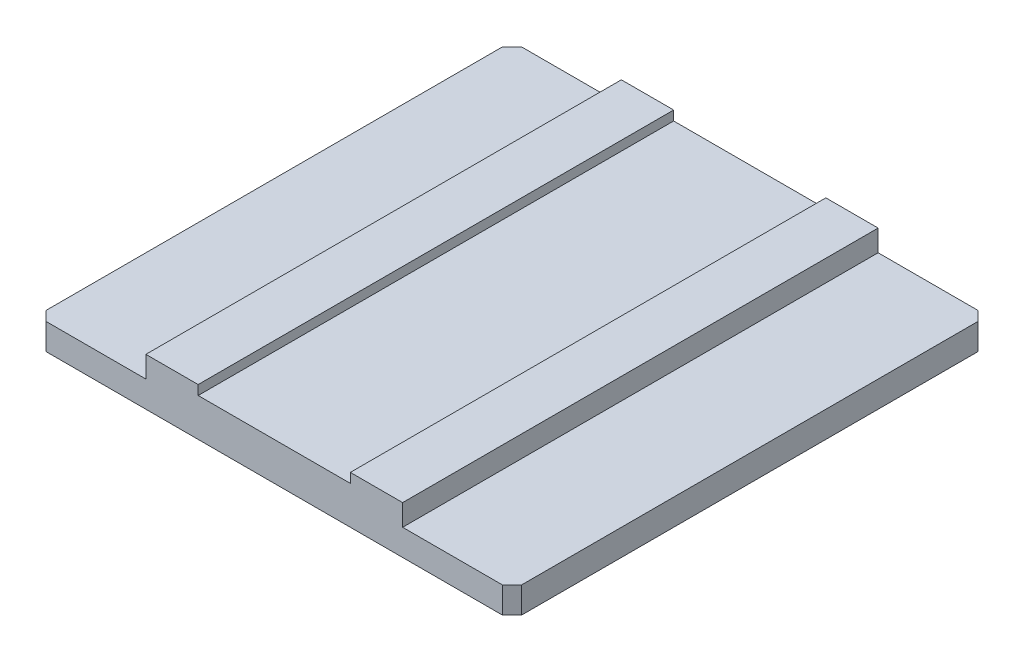
ISO-10303-21;
HEADER;
FILE_DESCRIPTION(('STEP AP214'),'2;1');
FILE_NAME('part.step','',(''),(''),'','','');
FILE_SCHEMA(('AUTOMOTIVE_DESIGN { 1 0 10303 214 1 1 1 1 }'));
ENDSEC;
DATA;
#1=APPLICATION_CONTEXT('core data for automotive mechanical design processes');
#2=APPLICATION_PROTOCOL_DEFINITION('international standard','automotive_design',2000,#1);
#3=PRODUCT_CONTEXT('',#1,'mechanical');
#4=PRODUCT('Part','Part','',(#3));
#5=PRODUCT_RELATED_PRODUCT_CATEGORY('part','',(#4));
#6=PRODUCT_DEFINITION_FORMATION('','',#4);
#7=PRODUCT_DEFINITION_CONTEXT('part definition',#1,'design');
#8=PRODUCT_DEFINITION('design','',#6,#7);
#9=PRODUCT_DEFINITION_SHAPE('','',#8);
#10=(LENGTH_UNIT() NAMED_UNIT(*) SI_UNIT(.MILLI.,.METRE.));
#11=(NAMED_UNIT(*) PLANE_ANGLE_UNIT() SI_UNIT($,.RADIAN.));
#12=(NAMED_UNIT(*) SI_UNIT($,.STERADIAN.) SOLID_ANGLE_UNIT());
#13=UNCERTAINTY_MEASURE_WITH_UNIT(LENGTH_MEASURE(1.E-05),#10,'distance_accuracy_value','');
#14=(GEOMETRIC_REPRESENTATION_CONTEXT(3) GLOBAL_UNCERTAINTY_ASSIGNED_CONTEXT((#13)) GLOBAL_UNIT_ASSIGNED_CONTEXT((#10,
#11,#12)) REPRESENTATION_CONTEXT('',''));
#15=CARTESIAN_POINT('',(0.,0.,0.));
#16=DIRECTION('',(0.,0.,1.));
#17=DIRECTION('',(1.,0.,0.));
#18=AXIS2_PLACEMENT_3D('',#15,#16,#17);
#19=CARTESIAN_POINT('',(50.,0.,100.));
#20=DIRECTION('',(-1.,0.,0.));
#21=DIRECTION('',(0.,0.,1.));
#22=AXIS2_PLACEMENT_3D('',#19,#20,#21);
#23=PLANE('',#22);
#24=DIRECTION('',(0.,0.,-1.));
#25=VECTOR('',#24,1.);
#26=CARTESIAN_POINT('',(50.,0.,100.));
#27=LINE('',#26,#25);
#28=CARTESIAN_POINT('',(50.,0.,98.));
#29=VERTEX_POINT('',#28);
#30=CARTESIAN_POINT('',(50.,0.,2.00000000000002));
#31=VERTEX_POINT('',#30);
#32=EDGE_CURVE('E216',#29,#31,#27,.T.);
#33=ORIENTED_EDGE('',*,*,#32,.T.);
#34=DIRECTION('',(0.,1.,0.));
#35=VECTOR('',#34,1.);
#36=CARTESIAN_POINT('',(50.,0.,2.00000000000002));
#37=LINE('',#36,#35);
#38=CARTESIAN_POINT('',(50.,5.5,2.00000000000002));
#39=VERTEX_POINT('',#38);
#40=EDGE_CURVE('E320',#31,#39,#37,.T.);
#41=ORIENTED_EDGE('',*,*,#40,.T.);
#42=DIRECTION('',(0.,0.,-1.));
#43=VECTOR('',#42,1.);
#44=CARTESIAN_POINT('',(50.,5.5,100.));
#45=LINE('',#44,#43);
#46=CARTESIAN_POINT('',(50.,5.5,98.));
#47=VERTEX_POINT('',#46);
#48=EDGE_CURVE('E182',#47,#39,#45,.T.);
#49=ORIENTED_EDGE('',*,*,#48,.F.);
#50=DIRECTION('',(0.,-1.,0.));
#51=VECTOR('',#50,1.);
#52=CARTESIAN_POINT('',(50.,0.,98.));
#53=LINE('',#52,#51);
#54=EDGE_CURVE('E317',#47,#29,#53,.T.);
#55=ORIENTED_EDGE('',*,*,#54,.T.);
#56=EDGE_LOOP('',(#33,#41,#49,#55));
#57=FACE_BOUND('',#56,.T.);
#58=ADVANCED_FACE('F47',(#57),#23,.F.);
#59=CARTESIAN_POINT('',(50.,5.5,100.));
#60=DIRECTION('',(0.,-1.,0.));
#61=DIRECTION('',(1.,0.,0.));
#62=AXIS2_PLACEMENT_3D('',#59,#60,#61);
#63=PLANE('',#62);
#64=ORIENTED_EDGE('',*,*,#48,.T.);
#65=DIRECTION('',(0.707106781186548,0.,0.707106781186548));
#66=VECTOR('',#65,1.);
#67=CARTESIAN_POINT('',(50.,5.5,2.00000000000002));
#68=LINE('',#67,#66);
#69=CARTESIAN_POINT('',(48.,5.5,0.));
#70=VERTEX_POINT('',#69);
#71=EDGE_CURVE('E71',#39,#70,#68,.F.);
#72=ORIENTED_EDGE('',*,*,#71,.T.);
#73=DIRECTION('',(-1.,0.,0.));
#74=VECTOR('',#73,1.);
#75=CARTESIAN_POINT('',(50.,5.5,0.));
#76=LINE('',#75,#74);
#77=CARTESIAN_POINT('',(27.,5.5,0.));
#78=VERTEX_POINT('',#77);
#79=EDGE_CURVE('E178',#70,#78,#76,.T.);
#80=ORIENTED_EDGE('',*,*,#79,.T.);
#81=DIRECTION('',(0.,0.,-1.));
#82=VECTOR('',#81,1.);
#83=CARTESIAN_POINT('',(27.,5.5,100.));
#84=LINE('',#83,#82);
#85=CARTESIAN_POINT('',(27.,5.5,100.));
#86=VERTEX_POINT('',#85);
#87=EDGE_CURVE('E174',#86,#78,#84,.T.);
#88=ORIENTED_EDGE('',*,*,#87,.F.);
#89=DIRECTION('',(-1.,0.,0.));
#90=VECTOR('',#89,1.);
#91=CARTESIAN_POINT('',(50.,5.5,100.));
#92=LINE('',#91,#90);
#93=CARTESIAN_POINT('',(48.,5.5,100.));
#94=VERTEX_POINT('',#93);
#95=EDGE_CURVE('E162',#94,#86,#92,.T.);
#96=ORIENTED_EDGE('',*,*,#95,.F.);
#97=DIRECTION('',(0.707106781186548,0.,-0.707106781186548));
#98=VECTOR('',#97,1.);
#99=CARTESIAN_POINT('',(48.,5.5,100.));
#100=LINE('',#99,#98);
#101=EDGE_CURVE('E64',#94,#47,#100,.T.);
#102=ORIENTED_EDGE('',*,*,#101,.T.);
#103=EDGE_LOOP('',(#64,#72,#80,#88,#96,#102));
#104=FACE_BOUND('',#103,.T.);
#105=ADVANCED_FACE('F176',(#104),#63,.F.);
#106=CARTESIAN_POINT('',(27.,5.5,100.));
#107=DIRECTION('',(-1.,0.,0.));
#108=DIRECTION('',(0.,0.,1.));
#109=AXIS2_PLACEMENT_3D('',#106,#107,#108);
#110=PLANE('',#109);
#111=DIRECTION('',(0.,1.,0.));
#112=VECTOR('',#111,1.);
#113=CARTESIAN_POINT('',(27.,5.5,0.));
#114=LINE('',#113,#112);
#115=CARTESIAN_POINT('',(27.,10.,0.));
#116=VERTEX_POINT('',#115);
#117=EDGE_CURVE('E219',#78,#116,#114,.T.);
#118=ORIENTED_EDGE('',*,*,#117,.T.);
#119=DIRECTION('',(0.,0.,-1.));
#120=VECTOR('',#119,1.);
#121=CARTESIAN_POINT('',(27.,10.,100.));
#122=LINE('',#121,#120);
#123=CARTESIAN_POINT('',(27.,10.,100.));
#124=VERTEX_POINT('',#123);
#125=EDGE_CURVE('E183',#124,#116,#122,.T.);
#126=ORIENTED_EDGE('',*,*,#125,.F.);
#127=DIRECTION('',(0.,1.,0.));
#128=VECTOR('',#127,1.);
#129=CARTESIAN_POINT('',(27.,5.5,100.));
#130=LINE('',#129,#128);
#131=EDGE_CURVE('E167',#86,#124,#130,.T.);
#132=ORIENTED_EDGE('',*,*,#131,.F.);
#133=ORIENTED_EDGE('',*,*,#87,.T.);
#134=EDGE_LOOP('',(#118,#126,#132,#133));
#135=FACE_BOUND('',#134,.T.);
#136=ADVANCED_FACE('F185',(#135),#110,.F.);
#137=CARTESIAN_POINT('',(27.,10.,100.));
#138=DIRECTION('',(0.,-1.,0.));
#139=DIRECTION('',(1.,0.,0.));
#140=AXIS2_PLACEMENT_3D('',#137,#138,#139);
#141=PLANE('',#140);
#142=DIRECTION('',(-1.,0.,0.));
#143=VECTOR('',#142,1.);
#144=CARTESIAN_POINT('',(27.,10.,0.));
#145=LINE('',#144,#143);
#146=CARTESIAN_POINT('',(16.,10.,0.));
#147=VERTEX_POINT('',#146);
#148=EDGE_CURVE('E222',#116,#147,#145,.T.);
#149=ORIENTED_EDGE('',*,*,#148,.T.);
#150=DIRECTION('',(0.,0.,-1.));
#151=VECTOR('',#150,1.);
#152=CARTESIAN_POINT('',(16.,10.,100.));
#153=LINE('',#152,#151);
#154=CARTESIAN_POINT('',(16.,10.,100.));
#155=VERTEX_POINT('',#154);
#156=EDGE_CURVE('E278',#155,#147,#153,.T.);
#157=ORIENTED_EDGE('',*,*,#156,.F.);
#158=DIRECTION('',(-1.,0.,0.));
#159=VECTOR('',#158,1.);
#160=CARTESIAN_POINT('',(27.,10.,100.));
#161=LINE('',#160,#159);
#162=EDGE_CURVE('E189',#124,#155,#161,.T.);
#163=ORIENTED_EDGE('',*,*,#162,.F.);
#164=ORIENTED_EDGE('',*,*,#125,.T.);
#165=EDGE_LOOP('',(#149,#157,#163,#164));
#166=FACE_BOUND('',#165,.T.);
#167=ADVANCED_FACE('F386',(#166),#141,.F.);
#168=CARTESIAN_POINT('',(16.,10.,100.));
#169=DIRECTION('',(1.,0.,0.));
#170=DIRECTION('',(0.,0.,-1.));
#171=AXIS2_PLACEMENT_3D('',#168,#169,#170);
#172=PLANE('',#171);
#173=DIRECTION('',(0.,-1.,0.));
#174=VECTOR('',#173,1.);
#175=CARTESIAN_POINT('',(16.,10.,0.));
#176=LINE('',#175,#174);
#177=CARTESIAN_POINT('',(16.,8.,0.));
#178=VERTEX_POINT('',#177);
#179=EDGE_CURVE('E225',#147,#178,#176,.T.);
#180=ORIENTED_EDGE('',*,*,#179,.T.);
#181=DIRECTION('',(0.,0.,-1.));
#182=VECTOR('',#181,1.);
#183=CARTESIAN_POINT('',(16.,8.,100.));
#184=LINE('',#183,#182);
#185=CARTESIAN_POINT('',(16.,8.,100.));
#186=VERTEX_POINT('',#185);
#187=EDGE_CURVE('E274',#186,#178,#184,.T.);
#188=ORIENTED_EDGE('',*,*,#187,.F.);
#189=DIRECTION('',(0.,-1.,0.));
#190=VECTOR('',#189,1.);
#191=CARTESIAN_POINT('',(16.,10.,100.));
#192=LINE('',#191,#190);
#193=EDGE_CURVE('E192',#155,#186,#192,.T.);
#194=ORIENTED_EDGE('',*,*,#193,.F.);
#195=ORIENTED_EDGE('',*,*,#156,.T.);
#196=EDGE_LOOP('',(#180,#188,#194,#195));
#197=FACE_BOUND('',#196,.T.);
#198=ADVANCED_FACE('F383',(#197),#172,.F.);
#199=CARTESIAN_POINT('',(16.,8.,100.));
#200=DIRECTION('',(0.,-1.,0.));
#201=DIRECTION('',(1.,0.,0.));
#202=AXIS2_PLACEMENT_3D('',#199,#200,#201);
#203=PLANE('',#202);
#204=DIRECTION('',(-1.,0.,0.));
#205=VECTOR('',#204,1.);
#206=CARTESIAN_POINT('',(16.,8.,0.));
#207=LINE('',#206,#205);
#208=CARTESIAN_POINT('',(-16.,8.,0.));
#209=VERTEX_POINT('',#208);
#210=EDGE_CURVE('E228',#178,#209,#207,.T.);
#211=ORIENTED_EDGE('',*,*,#210,.T.);
#212=DIRECTION('',(0.,0.,-1.));
#213=VECTOR('',#212,1.);
#214=CARTESIAN_POINT('',(-16.,8.,100.));
#215=LINE('',#214,#213);
#216=CARTESIAN_POINT('',(-16.,8.,100.));
#217=VERTEX_POINT('',#216);
#218=EDGE_CURVE('E270',#217,#209,#215,.T.);
#219=ORIENTED_EDGE('',*,*,#218,.F.);
#220=DIRECTION('',(-1.,0.,0.));
#221=VECTOR('',#220,1.);
#222=CARTESIAN_POINT('',(16.,8.,100.));
#223=LINE('',#222,#221);
#224=EDGE_CURVE('E197',#186,#217,#223,.T.);
#225=ORIENTED_EDGE('',*,*,#224,.F.);
#226=ORIENTED_EDGE('',*,*,#187,.T.);
#227=EDGE_LOOP('',(#211,#219,#225,#226));
#228=FACE_BOUND('',#227,.T.);
#229=ADVANCED_FACE('F378',(#228),#203,.F.);
#230=CARTESIAN_POINT('',(-16.,10.,100.));
#231=DIRECTION('',(-1.,0.,0.));
#232=DIRECTION('',(0.,0.,1.));
#233=AXIS2_PLACEMENT_3D('',#230,#231,#232);
#234=PLANE('',#233);
#235=DIRECTION('',(0.,1.,0.));
#236=VECTOR('',#235,1.);
#237=CARTESIAN_POINT('',(-16.,10.,0.));
#238=LINE('',#237,#236);
#239=CARTESIAN_POINT('',(-16.,10.,0.));
#240=VERTEX_POINT('',#239);
#241=EDGE_CURVE('E231',#209,#240,#238,.T.);
#242=ORIENTED_EDGE('',*,*,#241,.T.);
#243=DIRECTION('',(0.,0.,-1.));
#244=VECTOR('',#243,1.);
#245=CARTESIAN_POINT('',(-16.,10.,100.));
#246=LINE('',#245,#244);
#247=CARTESIAN_POINT('',(-16.,10.,100.));
#248=VERTEX_POINT('',#247);
#249=EDGE_CURVE('E266',#248,#240,#246,.T.);
#250=ORIENTED_EDGE('',*,*,#249,.F.);
#251=DIRECTION('',(0.,1.,0.));
#252=VECTOR('',#251,1.);
#253=CARTESIAN_POINT('',(-16.,10.,100.));
#254=LINE('',#253,#252);
#255=EDGE_CURVE('E200',#217,#248,#254,.T.);
#256=ORIENTED_EDGE('',*,*,#255,.F.);
#257=ORIENTED_EDGE('',*,*,#218,.T.);
#258=EDGE_LOOP('',(#242,#250,#256,#257));
#259=FACE_BOUND('',#258,.T.);
#260=ADVANCED_FACE('F373',(#259),#234,.F.);
#261=CARTESIAN_POINT('',(-27.,10.,100.));
#262=DIRECTION('',(0.,-1.,0.));
#263=DIRECTION('',(1.,0.,0.));
#264=AXIS2_PLACEMENT_3D('',#261,#262,#263);
#265=PLANE('',#264);
#266=DIRECTION('',(-1.,0.,0.));
#267=VECTOR('',#266,1.);
#268=CARTESIAN_POINT('',(-27.,10.,0.));
#269=LINE('',#268,#267);
#270=CARTESIAN_POINT('',(-27.,10.,0.));
#271=VERTEX_POINT('',#270);
#272=EDGE_CURVE('E234',#240,#271,#269,.T.);
#273=ORIENTED_EDGE('',*,*,#272,.T.);
#274=DIRECTION('',(0.,0.,-1.));
#275=VECTOR('',#274,1.);
#276=CARTESIAN_POINT('',(-27.,10.,100.));
#277=LINE('',#276,#275);
#278=CARTESIAN_POINT('',(-27.,10.,100.));
#279=VERTEX_POINT('',#278);
#280=EDGE_CURVE('E262',#279,#271,#277,.T.);
#281=ORIENTED_EDGE('',*,*,#280,.F.);
#282=DIRECTION('',(-1.,0.,0.));
#283=VECTOR('',#282,1.);
#284=CARTESIAN_POINT('',(-27.,10.,100.));
#285=LINE('',#284,#283);
#286=EDGE_CURVE('E203',#248,#279,#285,.T.);
#287=ORIENTED_EDGE('',*,*,#286,.F.);
#288=ORIENTED_EDGE('',*,*,#249,.T.);
#289=EDGE_LOOP('',(#273,#281,#287,#288));
#290=FACE_BOUND('',#289,.T.);
#291=ADVANCED_FACE('F369',(#290),#265,.F.);
#292=CARTESIAN_POINT('',(-27.,5.5,100.));
#293=DIRECTION('',(1.,0.,0.));
#294=DIRECTION('',(0.,0.,-1.));
#295=AXIS2_PLACEMENT_3D('',#292,#293,#294);
#296=PLANE('',#295);
#297=DIRECTION('',(0.,-1.,0.));
#298=VECTOR('',#297,1.);
#299=CARTESIAN_POINT('',(-27.,5.5,0.));
#300=LINE('',#299,#298);
#301=CARTESIAN_POINT('',(-27.,5.5,0.));
#302=VERTEX_POINT('',#301);
#303=EDGE_CURVE('E237',#271,#302,#300,.T.);
#304=ORIENTED_EDGE('',*,*,#303,.T.);
#305=DIRECTION('',(0.,0.,-1.));
#306=VECTOR('',#305,1.);
#307=CARTESIAN_POINT('',(-27.,5.5,100.));
#308=LINE('',#307,#306);
#309=CARTESIAN_POINT('',(-27.,5.5,100.));
#310=VERTEX_POINT('',#309);
#311=EDGE_CURVE('E258',#310,#302,#308,.T.);
#312=ORIENTED_EDGE('',*,*,#311,.F.);
#313=DIRECTION('',(0.,-1.,0.));
#314=VECTOR('',#313,1.);
#315=CARTESIAN_POINT('',(-27.,5.5,100.));
#316=LINE('',#315,#314);
#317=EDGE_CURVE('E206',#279,#310,#316,.T.);
#318=ORIENTED_EDGE('',*,*,#317,.F.);
#319=ORIENTED_EDGE('',*,*,#280,.T.);
#320=EDGE_LOOP('',(#304,#312,#318,#319));
#321=FACE_BOUND('',#320,.T.);
#322=ADVANCED_FACE('F365',(#321),#296,.F.);
#323=CARTESIAN_POINT('',(-50.,5.5,100.));
#324=DIRECTION('',(0.,-1.,0.));
#325=DIRECTION('',(1.,0.,0.));
#326=AXIS2_PLACEMENT_3D('',#323,#324,#325);
#327=PLANE('',#326);
#328=DIRECTION('',(-1.,0.,0.));
#329=VECTOR('',#328,1.);
#330=CARTESIAN_POINT('',(-50.,5.5,0.));
#331=LINE('',#330,#329);
#332=CARTESIAN_POINT('',(-48.,5.5,0.));
#333=VERTEX_POINT('',#332);
#334=EDGE_CURVE('E240',#302,#333,#331,.T.);
#335=ORIENTED_EDGE('',*,*,#334,.T.);
#336=DIRECTION('',(0.707106781186548,0.,-0.707106781186548));
#337=VECTOR('',#336,1.);
#338=CARTESIAN_POINT('',(-50.,5.5,2.00000000000002));
#339=LINE('',#338,#337);
#340=CARTESIAN_POINT('',(-50.,5.5,2.00000000000002));
#341=VERTEX_POINT('',#340);
#342=EDGE_CURVE('E314',#333,#341,#339,.F.);
#343=ORIENTED_EDGE('',*,*,#342,.T.);
#344=DIRECTION('',(0.,0.,-1.));
#345=VECTOR('',#344,1.);
#346=CARTESIAN_POINT('',(-50.,5.5,100.));
#347=LINE('',#346,#345);
#348=CARTESIAN_POINT('',(-50.,5.5,98.));
#349=VERTEX_POINT('',#348);
#350=EDGE_CURVE('E254',#349,#341,#347,.T.);
#351=ORIENTED_EDGE('',*,*,#350,.F.);
#352=DIRECTION('',(0.707106781186548,0.,0.707106781186548));
#353=VECTOR('',#352,1.);
#354=CARTESIAN_POINT('',(-48.,5.5,100.));
#355=LINE('',#354,#353);
#356=CARTESIAN_POINT('',(-48.,5.5,100.));
#357=VERTEX_POINT('',#356);
#358=EDGE_CURVE('E311',#349,#357,#355,.T.);
#359=ORIENTED_EDGE('',*,*,#358,.T.);
#360=DIRECTION('',(-1.,0.,0.));
#361=VECTOR('',#360,1.);
#362=CARTESIAN_POINT('',(-50.,5.5,100.));
#363=LINE('',#362,#361);
#364=EDGE_CURVE('E209',#310,#357,#363,.T.);
#365=ORIENTED_EDGE('',*,*,#364,.F.);
#366=ORIENTED_EDGE('',*,*,#311,.T.);
#367=EDGE_LOOP('',(#335,#343,#351,#359,#365,#366));
#368=FACE_BOUND('',#367,.T.);
#369=ADVANCED_FACE('F355',(#368),#327,.F.);
#370=CARTESIAN_POINT('',(-50.,0.,100.));
#371=DIRECTION('',(1.,0.,0.));
#372=DIRECTION('',(0.,0.,-1.));
#373=AXIS2_PLACEMENT_3D('',#370,#371,#372);
#374=PLANE('',#373);
#375=ORIENTED_EDGE('',*,*,#350,.T.);
#376=DIRECTION('',(0.,-1.,0.));
#377=VECTOR('',#376,1.);
#378=CARTESIAN_POINT('',(-50.,0.,2.00000000000002));
#379=LINE('',#378,#377);
#380=CARTESIAN_POINT('',(-50.,0.,2.00000000000002));
#381=VERTEX_POINT('',#380);
#382=EDGE_CURVE('E289',#341,#381,#379,.T.);
#383=ORIENTED_EDGE('',*,*,#382,.T.);
#384=DIRECTION('',(0.,0.,-1.));
#385=VECTOR('',#384,1.);
#386=CARTESIAN_POINT('',(-50.,0.,100.));
#387=LINE('',#386,#385);
#388=CARTESIAN_POINT('',(-50.,0.,98.));
#389=VERTEX_POINT('',#388);
#390=EDGE_CURVE('E250',#389,#381,#387,.T.);
#391=ORIENTED_EDGE('',*,*,#390,.F.);
#392=DIRECTION('',(0.,1.,0.));
#393=VECTOR('',#392,1.);
#394=CARTESIAN_POINT('',(-50.,5.5,98.));
#395=LINE('',#394,#393);
#396=EDGE_CURVE('E286',#389,#349,#395,.T.);
#397=ORIENTED_EDGE('',*,*,#396,.T.);
#398=EDGE_LOOP('',(#375,#383,#391,#397));
#399=FACE_BOUND('',#398,.T.);
#400=ADVANCED_FACE('F357',(#399),#374,.F.);
#401=CARTESIAN_POINT('',(-50.,0.,100.));
#402=DIRECTION('',(0.,1.,0.));
#403=DIRECTION('',(0.,0.,1.));
#404=AXIS2_PLACEMENT_3D('',#401,#402,#403);
#405=PLANE('',#404);
#406=ORIENTED_EDGE('',*,*,#390,.T.);
#407=DIRECTION('',(-0.707106781186548,0.,0.707106781186548));
#408=VECTOR('',#407,1.);
#409=CARTESIAN_POINT('',(-50.,0.,2.00000000000002));
#410=LINE('',#409,#408);
#411=CARTESIAN_POINT('',(-48.,0.,0.));
#412=VERTEX_POINT('',#411);
#413=EDGE_CURVE('E302',#381,#412,#410,.F.);
#414=ORIENTED_EDGE('',*,*,#413,.T.);
#415=DIRECTION('',(1.,0.,0.));
#416=VECTOR('',#415,1.);
#417=CARTESIAN_POINT('',(-50.,0.,0.));
#418=LINE('',#417,#416);
#419=CARTESIAN_POINT('',(48.,0.,0.));
#420=VERTEX_POINT('',#419);
#421=EDGE_CURVE('E171',#412,#420,#418,.T.);
#422=ORIENTED_EDGE('',*,*,#421,.T.);
#423=DIRECTION('',(-0.707106781186548,0.,-0.707106781186548));
#424=VECTOR('',#423,1.);
#425=CARTESIAN_POINT('',(50.,0.,2.00000000000002));
#426=LINE('',#425,#424);
#427=EDGE_CURVE('E299',#420,#31,#426,.F.);
#428=ORIENTED_EDGE('',*,*,#427,.T.);
#429=ORIENTED_EDGE('',*,*,#32,.F.);
#430=DIRECTION('',(-0.707106781186548,0.,0.707106781186548));
#431=VECTOR('',#430,1.);
#432=CARTESIAN_POINT('',(48.,0.,100.));
#433=LINE('',#432,#431);
#434=CARTESIAN_POINT('',(48.,0.,100.));
#435=VERTEX_POINT('',#434);
#436=EDGE_CURVE('E296',#29,#435,#433,.T.);
#437=ORIENTED_EDGE('',*,*,#436,.T.);
#438=DIRECTION('',(1.,0.,0.));
#439=VECTOR('',#438,1.);
#440=CARTESIAN_POINT('',(-50.,0.,100.));
#441=LINE('',#440,#439);
#442=CARTESIAN_POINT('',(-48.,0.,100.));
#443=VERTEX_POINT('',#442);
#444=EDGE_CURVE('E213',#443,#435,#441,.T.);
#445=ORIENTED_EDGE('',*,*,#444,.F.);
#446=DIRECTION('',(-0.707106781186548,0.,-0.707106781186548));
#447=VECTOR('',#446,1.);
#448=CARTESIAN_POINT('',(-48.,0.,100.));
#449=LINE('',#448,#447);
#450=EDGE_CURVE('E293',#443,#389,#449,.T.);
#451=ORIENTED_EDGE('',*,*,#450,.T.);
#452=EDGE_LOOP('',(#406,#414,#422,#428,#429,#437,#445,#451));
#453=FACE_BOUND('',#452,.T.);
#454=ADVANCED_FACE('F334',(#453),#405,.F.);
#455=CARTESIAN_POINT('',(0.,0.,100.));
#456=DIRECTION('',(0.,0.,1.));
#457=DIRECTION('',(1.,0.,0.));
#458=AXIS2_PLACEMENT_3D('',#455,#456,#457);
#459=PLANE('',#458);
#460=ORIENTED_EDGE('',*,*,#444,.T.);
#461=DIRECTION('',(0.,1.,0.));
#462=VECTOR('',#461,1.);
#463=CARTESIAN_POINT('',(48.,5.5,100.));
#464=LINE('',#463,#462);
#465=EDGE_CURVE('E11',#435,#94,#464,.T.);
#466=ORIENTED_EDGE('',*,*,#465,.T.);
#467=ORIENTED_EDGE('',*,*,#95,.T.);
#468=ORIENTED_EDGE('',*,*,#131,.T.);
#469=ORIENTED_EDGE('',*,*,#162,.T.);
#470=ORIENTED_EDGE('',*,*,#193,.T.);
#471=ORIENTED_EDGE('',*,*,#224,.T.);
#472=ORIENTED_EDGE('',*,*,#255,.T.);
#473=ORIENTED_EDGE('',*,*,#286,.T.);
#474=ORIENTED_EDGE('',*,*,#317,.T.);
#475=ORIENTED_EDGE('',*,*,#364,.T.);
#476=DIRECTION('',(0.,-1.,0.));
#477=VECTOR('',#476,1.);
#478=CARTESIAN_POINT('',(-48.,0.,100.));
#479=LINE('',#478,#477);
#480=EDGE_CURVE('E57',#357,#443,#479,.T.);
#481=ORIENTED_EDGE('',*,*,#480,.T.);
#482=EDGE_LOOP('',(#460,#466,#467,#468,#469,#470,#471,#472,#473,#474,#475,#481));
#483=FACE_BOUND('',#482,.T.);
#484=ADVANCED_FACE('F165',(#483),#459,.T.);
#485=CARTESIAN_POINT('',(0.,0.,0.));
#486=DIRECTION('',(0.,0.,1.));
#487=DIRECTION('',(1.,0.,0.));
#488=AXIS2_PLACEMENT_3D('',#485,#486,#487);
#489=PLANE('',#488);
#490=ORIENTED_EDGE('',*,*,#421,.F.);
#491=DIRECTION('',(0.,1.,0.));
#492=VECTOR('',#491,1.);
#493=CARTESIAN_POINT('',(-48.,0.,0.));
#494=LINE('',#493,#492);
#495=EDGE_CURVE('E308',#412,#333,#494,.T.);
#496=ORIENTED_EDGE('',*,*,#495,.T.);
#497=ORIENTED_EDGE('',*,*,#334,.F.);
#498=ORIENTED_EDGE('',*,*,#303,.F.);
#499=ORIENTED_EDGE('',*,*,#272,.F.);
#500=ORIENTED_EDGE('',*,*,#241,.F.);
#501=ORIENTED_EDGE('',*,*,#210,.F.);
#502=ORIENTED_EDGE('',*,*,#179,.F.);
#503=ORIENTED_EDGE('',*,*,#148,.F.);
#504=ORIENTED_EDGE('',*,*,#117,.F.);
#505=ORIENTED_EDGE('',*,*,#79,.F.);
#506=DIRECTION('',(0.,-1.,0.));
#507=VECTOR('',#506,1.);
#508=CARTESIAN_POINT('',(48.,0.,0.));
#509=LINE('',#508,#507);
#510=EDGE_CURVE('E305',#70,#420,#509,.T.);
#511=ORIENTED_EDGE('',*,*,#510,.T.);
#512=EDGE_LOOP('',(#490,#496,#497,#498,#499,#500,#501,#502,#503,#504,#505,#511));
#513=FACE_BOUND('',#512,.T.);
#514=ADVANCED_FACE('F343',(#513),#489,.F.);
#515=CARTESIAN_POINT('',(-50.,0.,2.00000000000002));
#516=DIRECTION('',(0.707106781186547,0.,0.707106781186547));
#517=DIRECTION('',(0.,-1.,0.));
#518=AXIS2_PLACEMENT_3D('',#515,#516,#517);
#519=PLANE('',#518);
#520=ORIENTED_EDGE('',*,*,#342,.F.);
#521=ORIENTED_EDGE('',*,*,#495,.F.);
#522=ORIENTED_EDGE('',*,*,#413,.F.);
#523=ORIENTED_EDGE('',*,*,#382,.F.);
#524=EDGE_LOOP('',(#520,#521,#522,#523));
#525=FACE_BOUND('',#524,.T.);
#526=ADVANCED_FACE('F351',(#525),#519,.F.);
#527=CARTESIAN_POINT('',(50.,0.,2.00000000000002));
#528=DIRECTION('',(-0.707106781186547,0.,0.707106781186547));
#529=DIRECTION('',(0.,1.,0.));
#530=AXIS2_PLACEMENT_3D('',#527,#528,#529);
#531=PLANE('',#530);
#532=ORIENTED_EDGE('',*,*,#427,.F.);
#533=ORIENTED_EDGE('',*,*,#510,.F.);
#534=ORIENTED_EDGE('',*,*,#71,.F.);
#535=ORIENTED_EDGE('',*,*,#40,.F.);
#536=EDGE_LOOP('',(#532,#533,#534,#535));
#537=FACE_BOUND('',#536,.T.);
#538=ADVANCED_FACE('F346',(#537),#531,.F.);
#539=CARTESIAN_POINT('',(48.,0.,100.));
#540=DIRECTION('',(0.707106781186547,0.,0.707106781186547));
#541=DIRECTION('',(0.,-1.,0.));
#542=AXIS2_PLACEMENT_3D('',#539,#540,#541);
#543=PLANE('',#542);
#544=ORIENTED_EDGE('',*,*,#436,.F.);
#545=ORIENTED_EDGE('',*,*,#54,.F.);
#546=ORIENTED_EDGE('',*,*,#101,.F.);
#547=ORIENTED_EDGE('',*,*,#465,.F.);
#548=EDGE_LOOP('',(#544,#545,#546,#547));
#549=FACE_BOUND('',#548,.T.);
#550=ADVANCED_FACE('F338',(#549),#543,.T.);
#551=CARTESIAN_POINT('',(-48.,0.,100.));
#552=DIRECTION('',(-0.707106781186547,0.,0.707106781186547));
#553=DIRECTION('',(0.,1.,0.));
#554=AXIS2_PLACEMENT_3D('',#551,#552,#553);
#555=PLANE('',#554);
#556=ORIENTED_EDGE('',*,*,#358,.F.);
#557=ORIENTED_EDGE('',*,*,#396,.F.);
#558=ORIENTED_EDGE('',*,*,#450,.F.);
#559=ORIENTED_EDGE('',*,*,#480,.F.);
#560=EDGE_LOOP('',(#556,#557,#558,#559));
#561=FACE_BOUND('',#560,.T.);
#562=ADVANCED_FACE('F50',(#561),#555,.T.);
#563=CLOSED_SHELL('',(#58,#105,#136,#167,#198,#229,#260,#291,#322,#369,#400,#454,#484,#514,#526,
#538,#550,#562));
#564=MANIFOLD_SOLID_BREP('B2',#563);
#565=ADVANCED_BREP_SHAPE_REPRESENTATION('',(#18,#564),#14);
#566=SHAPE_DEFINITION_REPRESENTATION(#9,#565);
ENDSEC;
END-ISO-10303-21;
